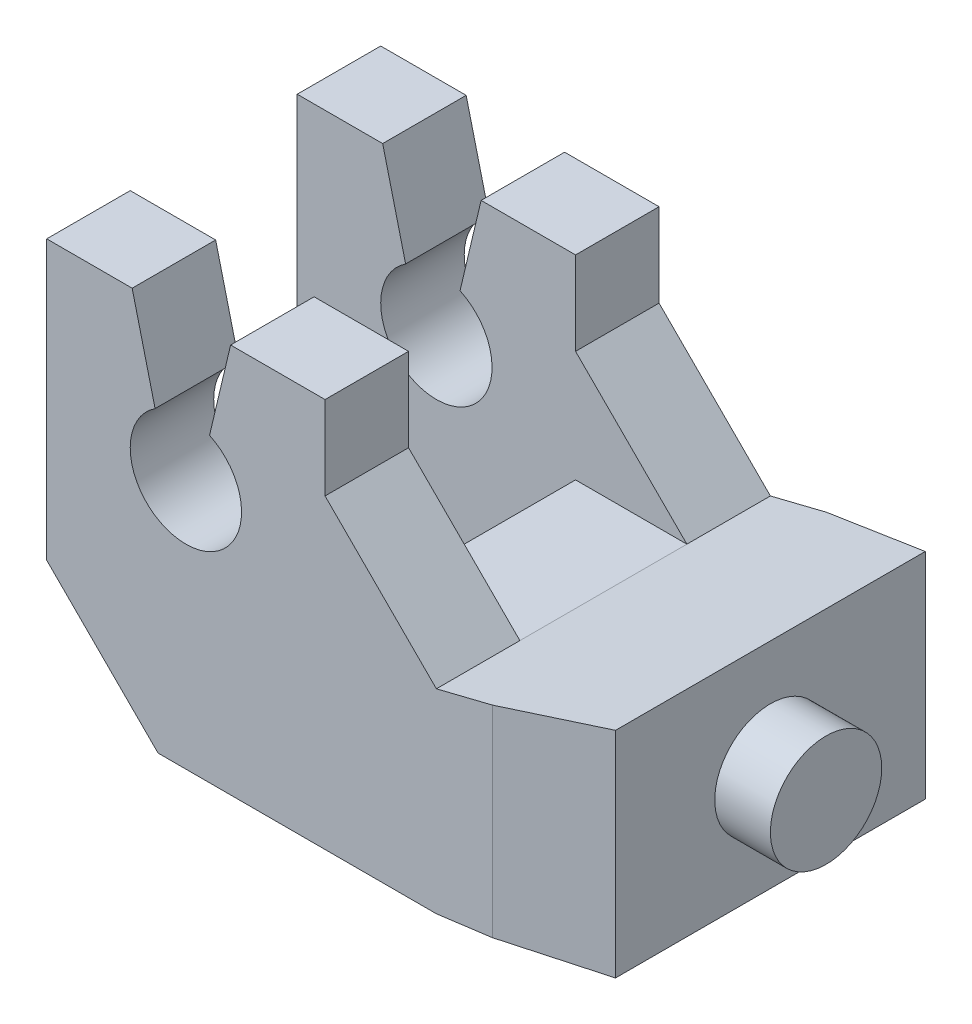
ISO-10303-21;
HEADER;
FILE_DESCRIPTION(('STEP AP214'),'2;1');
FILE_NAME('part.step','',(''),(''),'','','');
FILE_SCHEMA(('AUTOMOTIVE_DESIGN { 1 0 10303 214 1 1 1 1 }'));
ENDSEC;
DATA;
#1=APPLICATION_CONTEXT('core data for automotive mechanical design processes');
#2=APPLICATION_PROTOCOL_DEFINITION('international standard','automotive_design',2000,#1);
#3=PRODUCT_CONTEXT('',#1,'mechanical');
#4=PRODUCT('Part','Part','',(#3));
#5=PRODUCT_RELATED_PRODUCT_CATEGORY('part','',(#4));
#6=PRODUCT_DEFINITION_FORMATION('','',#4);
#7=PRODUCT_DEFINITION_CONTEXT('part definition',#1,'design');
#8=PRODUCT_DEFINITION('design','',#6,#7);
#9=PRODUCT_DEFINITION_SHAPE('','',#8);
#10=(LENGTH_UNIT() NAMED_UNIT(*) SI_UNIT(.MILLI.,.METRE.));
#11=(NAMED_UNIT(*) PLANE_ANGLE_UNIT() SI_UNIT($,.RADIAN.));
#12=(NAMED_UNIT(*) SI_UNIT($,.STERADIAN.) SOLID_ANGLE_UNIT());
#13=UNCERTAINTY_MEASURE_WITH_UNIT(LENGTH_MEASURE(1.E-05),#10,'distance_accuracy_value','');
#14=(GEOMETRIC_REPRESENTATION_CONTEXT(3) GLOBAL_UNCERTAINTY_ASSIGNED_CONTEXT((#13)) GLOBAL_UNIT_ASSIGNED_CONTEXT((#10,
#11,#12)) REPRESENTATION_CONTEXT('',''));
#15=CARTESIAN_POINT('',(0.,0.,0.));
#16=DIRECTION('',(0.,0.,1.));
#17=DIRECTION('',(1.,0.,0.));
#18=AXIS2_PLACEMENT_3D('',#15,#16,#17);
#19=CARTESIAN_POINT('',(0.,25.,30.));
#20=DIRECTION('',(0.,1.,0.));
#21=DIRECTION('',(0.,0.,1.));
#22=AXIS2_PLACEMENT_3D('',#19,#20,#21);
#23=PLANE('',#22);
#24=DIRECTION('',(0.,0.,-1.));
#25=VECTOR('',#24,1.);
#26=CARTESIAN_POINT('',(8.03300032595189,25.,54.3015491743099));
#27=LINE('',#26,#25);
#28=CARTESIAN_POINT('',(8.03300032595189,25.,-15.));
#29=VERTEX_POINT('',#28);
#30=CARTESIAN_POINT('',(8.03300032595189,25.,-30.));
#31=VERTEX_POINT('',#30);
#32=EDGE_CURVE('E505',#29,#31,#27,.T.);
#33=ORIENTED_EDGE('',*,*,#32,.F.);
#34=DIRECTION('',(1.,0.,0.));
#35=VECTOR('',#34,1.);
#36=CARTESIAN_POINT('',(0.,25.,-15.));
#37=LINE('',#36,#35);
#38=CARTESIAN_POINT('',(25.,25.,-15.));
#39=VERTEX_POINT('',#38);
#40=EDGE_CURVE('E439',#29,#39,#37,.T.);
#41=ORIENTED_EDGE('',*,*,#40,.T.);
#42=DIRECTION('',(0.,0.,-1.));
#43=VECTOR('',#42,1.);
#44=CARTESIAN_POINT('',(25.,25.,30.));
#45=LINE('',#44,#43);
#46=CARTESIAN_POINT('',(25.,25.,-30.));
#47=VERTEX_POINT('',#46);
#48=EDGE_CURVE('E328',#39,#47,#45,.T.);
#49=ORIENTED_EDGE('',*,*,#48,.T.);
#50=DIRECTION('',(1.,0.,0.));
#51=VECTOR('',#50,1.);
#52=CARTESIAN_POINT('',(0.,25.,-30.));
#53=LINE('',#52,#51);
#54=EDGE_CURVE('E315',#31,#47,#53,.T.);
#55=ORIENTED_EDGE('',*,*,#54,.F.);
#56=EDGE_LOOP('',(#33,#41,#49,#55));
#57=FACE_BOUND('',#56,.T.);
#58=ADVANCED_FACE('F53',(#57),#23,.T.);
#59=CARTESIAN_POINT('',(8.03300032595189,25.,30.));
#60=VERTEX_POINT('',#59);
#61=CARTESIAN_POINT('',(8.03300032595189,25.,15.));
#62=VERTEX_POINT('',#61);
#63=EDGE_CURVE('E507',#60,#62,#27,.T.);
#64=ORIENTED_EDGE('',*,*,#63,.F.);
#65=DIRECTION('',(1.,0.,0.));
#66=VECTOR('',#65,1.);
#67=CARTESIAN_POINT('',(0.,25.,30.));
#68=LINE('',#67,#66);
#69=CARTESIAN_POINT('',(25.,25.,30.));
#70=VERTEX_POINT('',#69);
#71=EDGE_CURVE('E244',#60,#70,#68,.T.);
#72=ORIENTED_EDGE('',*,*,#71,.T.);
#73=CARTESIAN_POINT('',(25.,25.,15.));
#74=VERTEX_POINT('',#73);
#75=EDGE_CURVE('E329',#70,#74,#45,.T.);
#76=ORIENTED_EDGE('',*,*,#75,.T.);
#77=DIRECTION('',(1.,0.,0.));
#78=VECTOR('',#77,1.);
#79=CARTESIAN_POINT('',(0.,25.,15.));
#80=LINE('',#79,#78);
#81=EDGE_CURVE('E462',#62,#74,#80,.T.);
#82=ORIENTED_EDGE('',*,*,#81,.F.);
#83=EDGE_LOOP('',(#64,#72,#76,#82));
#84=FACE_BOUND('',#83,.T.);
#85=ADVANCED_FACE('F535',(#84),#23,.T.);
#86=CARTESIAN_POINT('',(6.5430535547537,-50.0318697234433,30.));
#87=DIRECTION('',(0.129673524416725,-0.991556744248833,0.));
#88=DIRECTION('',(0.991556744248833,0.129673524416725,0.));
#89=AXIS2_PLACEMENT_3D('',#86,#87,#88);
#90=PLANE('',#89);
#91=DIRECTION('',(-0.985798498601788,-0.128920474213758,-0.107614271743853));
#92=VECTOR('',#91,1.);
#93=CARTESIAN_POINT('',(13.4702441494748,-49.1259475723067,-34.5416810296495));
#94=LINE('',#93,#92);
#95=CARTESIAN_POINT('',(75.,-41.0792267528315,-27.8248115316507));
#96=VERTEX_POINT('',#95);
#97=CARTESIAN_POINT('',(55.0742272235172,-43.6850737682847,-30.));
#98=VERTEX_POINT('',#97);
#99=EDGE_CURVE('E415',#96,#98,#94,.T.);
#100=ORIENTED_EDGE('',*,*,#99,.F.);
#101=DIRECTION('',(0.,0.,1.));
#102=VECTOR('',#101,1.);
#103=CARTESIAN_POINT('',(75.,-41.0792267528315,30.));
#104=LINE('',#103,#102);
#105=CARTESIAN_POINT('',(75.,-41.0792267528315,27.8248115316507));
#106=VERTEX_POINT('',#105);
#107=EDGE_CURVE('E404',#96,#106,#104,.T.);
#108=ORIENTED_EDGE('',*,*,#107,.T.);
#109=DIRECTION('',(-0.985798498601788,-0.128920474213758,0.107614271743853));
#110=VECTOR('',#109,1.);
#111=CARTESIAN_POINT('',(7.10508489868191,-49.9583685490299,35.236530918627));
#112=LINE('',#111,#110);
#113=CARTESIAN_POINT('',(55.074227223517,-43.6850737682847,30.));
#114=VERTEX_POINT('',#113);
#115=EDGE_CURVE('E422',#106,#114,#112,.T.);
#116=ORIENTED_EDGE('',*,*,#115,.T.);
#117=DIRECTION('',(-0.991556744248833,-0.129673524416725,0.));
#118=VECTOR('',#117,1.);
#119=CARTESIAN_POINT('',(6.5430535547537,-50.0318697234433,30.));
#120=LINE('',#119,#118);
#121=CARTESIAN_POINT('',(45.0022623154872,-45.0022623154871,30.));
#122=VERTEX_POINT('',#121);
#123=EDGE_CURVE('E271',#114,#122,#120,.T.);
#124=ORIENTED_EDGE('',*,*,#123,.T.);
#125=DIRECTION('',(0.,0.,-1.));
#126=VECTOR('',#125,1.);
#127=CARTESIAN_POINT('',(45.0022623154872,-45.0022623154871,30.));
#128=LINE('',#127,#126);
#129=CARTESIAN_POINT('',(45.0022623154872,-45.0022623154871,-30.));
#130=VERTEX_POINT('',#129);
#131=EDGE_CURVE('E338',#122,#130,#128,.T.);
#132=ORIENTED_EDGE('',*,*,#131,.T.);
#133=DIRECTION('',(-0.991556744248833,-0.129673524416725,0.));
#134=VECTOR('',#133,1.);
#135=CARTESIAN_POINT('',(6.5430535547537,-50.0318697234433,-30.));
#136=LINE('',#135,#134);
#137=EDGE_CURVE('E304',#98,#130,#136,.T.);
#138=ORIENTED_EDGE('',*,*,#137,.F.);
#139=EDGE_LOOP('',(#100,#108,#116,#124,#132,#138));
#140=FACE_BOUND('',#139,.T.);
#141=ADVANCED_FACE('F542',(#140),#90,.T.);
#142=CARTESIAN_POINT('',(4.9547361598082,-19.9470303665329,30.));
#143=DIRECTION('',(-0.241069014795778,0.970507975292008,0.));
#144=DIRECTION('',(-0.970507975292008,-0.241069014795778,0.));
#145=AXIS2_PLACEMENT_3D('',#142,#143,#144);
#146=PLANE('',#145);
#147=DIRECTION('',(0.965106735807369,0.239727375659998,-0.1053554643026));
#148=VECTOR('',#147,1.);
#149=CARTESIAN_POINT('',(5.51105117651429,-19.8088446777929,35.4105429285758));
#150=LINE('',#149,#148);
#151=CARTESIAN_POINT('',(55.0742272235172,-7.49761558541405,30.));
#152=VERTEX_POINT('',#151);
#153=CARTESIAN_POINT('',(75.,-2.54815969781461,27.8248115316507));
#154=VERTEX_POINT('',#153);
#155=EDGE_CURVE('E418',#152,#154,#150,.T.);
#156=ORIENTED_EDGE('',*,*,#155,.T.);
#157=DIRECTION('',(0.,0.,-1.));
#158=VECTOR('',#157,1.);
#159=CARTESIAN_POINT('',(75.,-2.54815969781461,30.));
#160=LINE('',#159,#158);
#161=CARTESIAN_POINT('',(75.,-2.54815969781461,-27.8248115316507));
#162=VERTEX_POINT('',#161);
#163=EDGE_CURVE('E400',#154,#162,#160,.T.);
#164=ORIENTED_EDGE('',*,*,#163,.T.);
#165=DIRECTION('',(0.965106735807369,0.239727375659998,0.1053554643026));
#166=VECTOR('',#165,1.);
#167=CARTESIAN_POINT('',(11.6118072716674,-18.2934493396707,-34.7445564970709));
#168=LINE('',#167,#166);
#169=CARTESIAN_POINT('',(55.074227223517,-7.49761558541404,-30.));
#170=VERTEX_POINT('',#169);
#171=EDGE_CURVE('E411',#170,#162,#168,.T.);
#172=ORIENTED_EDGE('',*,*,#171,.F.);
#173=DIRECTION('',(0.970507975292008,0.241069014795778,0.));
#174=VECTOR('',#173,1.);
#175=CARTESIAN_POINT('',(4.9547361598082,-19.9470303665329,-30.));
#176=LINE('',#175,#174);
#177=CARTESIAN_POINT('',(45.,-10.,-30.));
#178=VERTEX_POINT('',#177);
#179=EDGE_CURVE('E307',#178,#170,#176,.T.);
#180=ORIENTED_EDGE('',*,*,#179,.F.);
#181=DIRECTION('',(0.,0.,-1.));
#182=VECTOR('',#181,1.);
#183=CARTESIAN_POINT('',(45.,-10.,30.));
#184=LINE('',#183,#182);
#185=CARTESIAN_POINT('',(45.,-10.,-15.));
#186=VERTEX_POINT('',#185);
#187=EDGE_CURVE('E333',#186,#178,#184,.T.);
#188=ORIENTED_EDGE('',*,*,#187,.F.);
#189=CARTESIAN_POINT('',(45.,-10.,15.));
#190=VERTEX_POINT('',#189);
#191=EDGE_CURVE('E339',#190,#186,#184,.T.);
#192=ORIENTED_EDGE('',*,*,#191,.F.);
#193=CARTESIAN_POINT('',(45.,-10.,30.));
#194=VERTEX_POINT('',#193);
#195=EDGE_CURVE('E334',#194,#190,#184,.T.);
#196=ORIENTED_EDGE('',*,*,#195,.F.);
#197=DIRECTION('',(0.970507975292008,0.241069014795778,0.));
#198=VECTOR('',#197,1.);
#199=CARTESIAN_POINT('',(4.9547361598082,-19.9470303665329,30.));
#200=LINE('',#199,#198);
#201=EDGE_CURVE('E274',#194,#152,#200,.T.);
#202=ORIENTED_EDGE('',*,*,#201,.T.);
#203=EDGE_LOOP('',(#156,#164,#172,#180,#188,#192,#196,#202));
#204=FACE_BOUND('',#203,.T.);
#205=ADVANCED_FACE('F616',(#204),#146,.T.);
#206=CARTESIAN_POINT('',(3.88495481745911,-45.0022623154871,-35.5880550425761));
#207=DIRECTION('',(-0.10851987710541,0.,0.994094279368424));
#208=DIRECTION('',(0.994094279368424,0.,0.10851987710541));
#209=AXIS2_PLACEMENT_3D('',#206,#207,#208);
#210=PLANE('',#209);
#211=DIRECTION('',(0.,1.,0.));
#212=VECTOR('',#211,1.);
#213=CARTESIAN_POINT('',(75.,-45.0022623154871,-27.8248115316507));
#214=LINE('',#213,#212);
#215=EDGE_CURVE('E408',#96,#162,#214,.T.);
#216=ORIENTED_EDGE('',*,*,#215,.F.);
#217=ORIENTED_EDGE('',*,*,#99,.T.);
#218=DIRECTION('',(0.,-1.,0.));
#219=VECTOR('',#218,1.);
#220=CARTESIAN_POINT('',(55.0742272235172,0.,-30.));
#221=LINE('',#220,#219);
#222=EDGE_CURVE('E375',#170,#98,#221,.T.);
#223=ORIENTED_EDGE('',*,*,#222,.F.);
#224=ORIENTED_EDGE('',*,*,#171,.T.);
#225=EDGE_LOOP('',(#216,#217,#223,#224));
#226=FACE_BOUND('',#225,.T.);
#227=ADVANCED_FACE('F626',(#226),#210,.F.);
#228=CARTESIAN_POINT('',(3.88495481745911,-45.0022623154871,35.5880550425761));
#229=DIRECTION('',(0.10851987710541,0.,0.994094279368424));
#230=DIRECTION('',(0.994094279368424,0.,-0.10851987710541));
#231=AXIS2_PLACEMENT_3D('',#228,#229,#230);
#232=PLANE('',#231);
#233=ORIENTED_EDGE('',*,*,#115,.F.);
#234=DIRECTION('',(0.,1.,0.));
#235=VECTOR('',#234,1.);
#236=CARTESIAN_POINT('',(75.,-45.0022623154871,27.8248115316507));
#237=LINE('',#236,#235);
#238=EDGE_CURVE('E383',#106,#154,#237,.T.);
#239=ORIENTED_EDGE('',*,*,#238,.T.);
#240=ORIENTED_EDGE('',*,*,#155,.F.);
#241=DIRECTION('',(0.,1.,0.));
#242=VECTOR('',#241,1.);
#243=CARTESIAN_POINT('',(55.0742272235172,0.,30.));
#244=LINE('',#243,#242);
#245=EDGE_CURVE('E379',#114,#152,#244,.T.);
#246=ORIENTED_EDGE('',*,*,#245,.F.);
#247=EDGE_LOOP('',(#233,#239,#240,#246));
#248=FACE_BOUND('',#247,.T.);
#249=ADVANCED_FACE('F620',(#248),#232,.T.);
#250=CARTESIAN_POINT('',(0.,0.,30.));
#251=DIRECTION('',(0.,0.,1.));
#252=DIRECTION('',(1.,0.,0.));
#253=AXIS2_PLACEMENT_3D('',#250,#251,#252);
#254=PLANE('',#253);
#255=DIRECTION('',(-0.230772276710055,-0.973007788407707,0.));
#256=VECTOR('',#255,1.);
#257=CARTESIAN_POINT('',(8.03300032595189,25.,30.));
#258=LINE('',#257,#256);
#259=CARTESIAN_POINT('',(4.25047825097112,9.05170893467203,30.));
#260=VERTEX_POINT('',#259);
#261=EDGE_CURVE('E229',#60,#260,#258,.T.);
#262=ORIENTED_EDGE('',*,*,#261,.T.);
#263=CARTESIAN_POINT('',(0.,0.,30.));
#264=DIRECTION('',(0.,0.,1.));
#265=DIRECTION('',(1.,0.,0.));
#266=AXIS2_PLACEMENT_3D('',#263,#264,#265);
#267=CIRCLE('',#266,10.);
#268=CARTESIAN_POINT('',(-5.53088138921775,8.33122746408983,30.));
#269=VERTEX_POINT('',#268);
#270=EDGE_CURVE('E242',#269,#260,#267,.T.);
#271=ORIENTED_EDGE('',*,*,#270,.F.);
#272=DIRECTION('',(-0.23994426278264,0.970786665935259,0.));
#273=VECTOR('',#272,1.);
#274=CARTESIAN_POINT('',(-9.65081471542106,25.,30.));
#275=LINE('',#274,#273);
#276=CARTESIAN_POINT('',(-9.65081471542106,25.,30.));
#277=VERTEX_POINT('',#276);
#278=EDGE_CURVE('E509',#269,#277,#275,.T.);
#279=ORIENTED_EDGE('',*,*,#278,.T.);
#280=CARTESIAN_POINT('',(-25.,25.,30.));
#281=VERTEX_POINT('',#280);
#282=EDGE_CURVE('E282',#281,#277,#68,.T.);
#283=ORIENTED_EDGE('',*,*,#282,.F.);
#284=DIRECTION('',(0.,1.,0.));
#285=VECTOR('',#284,1.);
#286=CARTESIAN_POINT('',(-25.,0.,30.));
#287=LINE('',#286,#285);
#288=CARTESIAN_POINT('',(-25.,-25.,30.));
#289=VERTEX_POINT('',#288);
#290=EDGE_CURVE('E286',#289,#281,#287,.T.);
#291=ORIENTED_EDGE('',*,*,#290,.F.);
#292=DIRECTION('',(-0.707106781186549,0.707106781186546,0.));
#293=VECTOR('',#292,1.);
#294=CARTESIAN_POINT('',(-24.9999999999999,-25.0000000000001,30.));
#295=LINE('',#294,#293);
#296=CARTESIAN_POINT('',(-4.99773768451284,-45.0022623154871,30.));
#297=VERTEX_POINT('',#296);
#298=EDGE_CURVE('E251',#297,#289,#295,.T.);
#299=ORIENTED_EDGE('',*,*,#298,.F.);
#300=DIRECTION('',(-1.,0.,0.));
#301=VECTOR('',#300,1.);
#302=CARTESIAN_POINT('',(0.,-45.0022623154871,30.));
#303=LINE('',#302,#301);
#304=EDGE_CURVE('E258',#122,#297,#303,.T.);
#305=ORIENTED_EDGE('',*,*,#304,.F.);
#306=ORIENTED_EDGE('',*,*,#123,.F.);
#307=ORIENTED_EDGE('',*,*,#245,.T.);
#308=ORIENTED_EDGE('',*,*,#201,.F.);
#309=DIRECTION('',(0.707106781186544,-0.707106781186551,0.));
#310=VECTOR('',#309,1.);
#311=CARTESIAN_POINT('',(25.,10.0000000000002,30.));
#312=LINE('',#311,#310);
#313=CARTESIAN_POINT('',(25.,10.0000000000002,30.));
#314=VERTEX_POINT('',#313);
#315=EDGE_CURVE('E372',#194,#314,#312,.F.);
#316=ORIENTED_EDGE('',*,*,#315,.T.);
#317=DIRECTION('',(0.,-1.,0.));
#318=VECTOR('',#317,1.);
#319=CARTESIAN_POINT('',(25.,0.,30.));
#320=LINE('',#319,#318);
#321=EDGE_CURVE('E278',#70,#314,#320,.T.);
#322=ORIENTED_EDGE('',*,*,#321,.F.);
#323=ORIENTED_EDGE('',*,*,#71,.F.);
#324=EDGE_LOOP('',(#262,#271,#279,#283,#291,#299,#305,#306,#307,#308,#316,#322,#323));
#325=FACE_BOUND('',#324,.T.);
#326=ADVANCED_FACE('F240',(#325),#254,.T.);
#327=CARTESIAN_POINT('',(-24.9999999999999,-25.0000000000001,30.));
#328=DIRECTION('',(-0.707106781186546,-0.707106781186549,0.));
#329=DIRECTION('',(0.707106781186549,-0.707106781186546,0.));
#330=AXIS2_PLACEMENT_3D('',#327,#328,#329);
#331=PLANE('',#330);
#332=DIRECTION('',(0.,0.,-1.));
#333=VECTOR('',#332,1.);
#334=CARTESIAN_POINT('',(-4.99773768451284,-45.0022623154871,30.));
#335=LINE('',#334,#333);
#336=CARTESIAN_POINT('',(-4.99773768451284,-45.0022623154871,-15.));
#337=VERTEX_POINT('',#336);
#338=CARTESIAN_POINT('',(-4.99773768451284,-45.0022623154871,-30.));
#339=VERTEX_POINT('',#338);
#340=EDGE_CURVE('E343',#337,#339,#335,.T.);
#341=ORIENTED_EDGE('',*,*,#340,.F.);
#342=DIRECTION('',(-0.707106781186549,0.707106781186546,0.));
#343=VECTOR('',#342,1.);
#344=CARTESIAN_POINT('',(-24.9999999999999,-25.0000000000001,-15.));
#345=LINE('',#344,#343);
#346=CARTESIAN_POINT('',(-25.,-25.,-15.));
#347=VERTEX_POINT('',#346);
#348=EDGE_CURVE('E448',#337,#347,#345,.T.);
#349=ORIENTED_EDGE('',*,*,#348,.T.);
#350=DIRECTION('',(0.,0.,-1.));
#351=VECTOR('',#350,1.);
#352=CARTESIAN_POINT('',(-25.,-25.,30.));
#353=LINE('',#352,#351);
#354=CARTESIAN_POINT('',(-25.,-25.,-30.));
#355=VERTEX_POINT('',#354);
#356=EDGE_CURVE('E290',#347,#355,#353,.T.);
#357=ORIENTED_EDGE('',*,*,#356,.T.);
#358=DIRECTION('',(-0.707106781186549,0.707106781186546,0.));
#359=VECTOR('',#358,1.);
#360=CARTESIAN_POINT('',(-24.9999999999999,-25.0000000000001,-30.));
#361=LINE('',#360,#359);
#362=EDGE_CURVE('E295',#339,#355,#361,.T.);
#363=ORIENTED_EDGE('',*,*,#362,.F.);
#364=EDGE_LOOP('',(#341,#349,#357,#363));
#365=FACE_BOUND('',#364,.T.);
#366=ADVANCED_FACE('F566',(#365),#331,.T.);
#367=CARTESIAN_POINT('',(25.,0.,30.));
#368=DIRECTION('',(1.,0.,0.));
#369=DIRECTION('',(0.,1.,0.));
#370=AXIS2_PLACEMENT_3D('',#367,#368,#369);
#371=PLANE('',#370);
#372=DIRECTION('',(0.,-1.,0.));
#373=VECTOR('',#372,1.);
#374=CARTESIAN_POINT('',(25.,0.,-15.));
#375=LINE('',#374,#373);
#376=CARTESIAN_POINT('',(25.,10.0000000000002,-15.));
#377=VERTEX_POINT('',#376);
#378=EDGE_CURVE('E435',#39,#377,#375,.T.);
#379=ORIENTED_EDGE('',*,*,#378,.T.);
#380=DIRECTION('',(0.,0.,-1.));
#381=VECTOR('',#380,1.);
#382=CARTESIAN_POINT('',(25.,10.0000000000002,-30.));
#383=LINE('',#382,#381);
#384=CARTESIAN_POINT('',(25.,10.0000000000002,-30.));
#385=VERTEX_POINT('',#384);
#386=EDGE_CURVE('E348',#377,#385,#383,.T.);
#387=ORIENTED_EDGE('',*,*,#386,.T.);
#388=DIRECTION('',(0.,-1.,0.));
#389=VECTOR('',#388,1.);
#390=CARTESIAN_POINT('',(25.,0.,-30.));
#391=LINE('',#390,#389);
#392=EDGE_CURVE('E311',#47,#385,#391,.T.);
#393=ORIENTED_EDGE('',*,*,#392,.F.);
#394=ORIENTED_EDGE('',*,*,#48,.F.);
#395=EDGE_LOOP('',(#379,#387,#393,#394));
#396=FACE_BOUND('',#395,.T.);
#397=ADVANCED_FACE('F557',(#396),#371,.T.);
#398=DIRECTION('',(0.,0.,-1.));
#399=VECTOR('',#398,1.);
#400=CARTESIAN_POINT('',(-9.65081471542106,25.,54.3015491743099));
#401=LINE('',#400,#399);
#402=CARTESIAN_POINT('',(-9.65081471542106,25.,-15.));
#403=VERTEX_POINT('',#402);
#404=CARTESIAN_POINT('',(-9.65081471542106,25.,-30.));
#405=VERTEX_POINT('',#404);
#406=EDGE_CURVE('E69',#403,#405,#401,.T.);
#407=ORIENTED_EDGE('',*,*,#406,.T.);
#408=CARTESIAN_POINT('',(-25.,25.,-30.));
#409=VERTEX_POINT('',#408);
#410=EDGE_CURVE('E262',#409,#405,#53,.T.);
#411=ORIENTED_EDGE('',*,*,#410,.F.);
#412=DIRECTION('',(0.,0.,-1.));
#413=VECTOR('',#412,1.);
#414=CARTESIAN_POINT('',(-25.,25.,30.));
#415=LINE('',#414,#413);
#416=CARTESIAN_POINT('',(-25.,25.,-15.));
#417=VERTEX_POINT('',#416);
#418=EDGE_CURVE('E323',#417,#409,#415,.T.);
#419=ORIENTED_EDGE('',*,*,#418,.F.);
#420=EDGE_CURVE('E440',#417,#403,#37,.T.);
#421=ORIENTED_EDGE('',*,*,#420,.T.);
#422=EDGE_LOOP('',(#407,#411,#419,#421));
#423=FACE_BOUND('',#422,.T.);
#424=ADVANCED_FACE('F544',(#423),#23,.T.);
#425=CARTESIAN_POINT('',(0.,0.,30.));
#426=DIRECTION('',(0.,0.,-1.));
#427=DIRECTION('',(-1.,0.,0.));
#428=AXIS2_PLACEMENT_3D('',#425,#426,#427);
#429=CYLINDRICAL_SURFACE('',#428,10.);
#430=DIRECTION('',(0.,0.,-1.));
#431=VECTOR('',#430,1.);
#432=CARTESIAN_POINT('',(4.25047825097112,9.05170893467203,54.3015491743099));
#433=LINE('',#432,#431);
#434=CARTESIAN_POINT('',(4.25047825097112,9.05170893467203,-15.));
#435=VERTEX_POINT('',#434);
#436=CARTESIAN_POINT('',(4.25047825097112,9.05170893467203,-30.));
#437=VERTEX_POINT('',#436);
#438=EDGE_CURVE('E77',#435,#437,#433,.T.);
#439=ORIENTED_EDGE('',*,*,#438,.T.);
#440=CARTESIAN_POINT('',(0.,0.,-30.));
#441=DIRECTION('',(0.,0.,1.));
#442=DIRECTION('',(1.,0.,0.));
#443=AXIS2_PLACEMENT_3D('',#440,#441,#442);
#444=CIRCLE('',#443,10.);
#445=CARTESIAN_POINT('',(-5.53088138921775,8.33122746408983,-30.));
#446=VERTEX_POINT('',#445);
#447=EDGE_CURVE('E291',#446,#437,#444,.T.);
#448=ORIENTED_EDGE('',*,*,#447,.F.);
#449=DIRECTION('',(0.,0.,-1.));
#450=VECTOR('',#449,1.);
#451=CARTESIAN_POINT('',(-5.53088138921775,8.33122746408983,54.3015491743099));
#452=LINE('',#451,#450);
#453=CARTESIAN_POINT('',(-5.53088138921775,8.33122746408983,-15.));
#454=VERTEX_POINT('',#453);
#455=EDGE_CURVE('E235',#454,#446,#452,.T.);
#456=ORIENTED_EDGE('',*,*,#455,.F.);
#457=CARTESIAN_POINT('',(0.,0.,-15.));
#458=DIRECTION('',(0.,0.,1.));
#459=DIRECTION('',(1.,0.,0.));
#460=AXIS2_PLACEMENT_3D('',#457,#458,#459);
#461=CIRCLE('',#460,10.);
#462=EDGE_CURVE('E426',#454,#435,#461,.T.);
#463=ORIENTED_EDGE('',*,*,#462,.T.);
#464=EDGE_LOOP('',(#439,#448,#456,#463));
#465=FACE_BOUND('',#464,.T.);
#466=ADVANCED_FACE('F554',(#465),#429,.F.);
#467=CARTESIAN_POINT('',(-25.,0.,30.));
#468=DIRECTION('',(-1.,0.,0.));
#469=DIRECTION('',(0.,-1.,0.));
#470=AXIS2_PLACEMENT_3D('',#467,#468,#469);
#471=PLANE('',#470);
#472=ORIENTED_EDGE('',*,*,#356,.F.);
#473=DIRECTION('',(0.,1.,0.));
#474=VECTOR('',#473,1.);
#475=CARTESIAN_POINT('',(-25.,0.,-15.));
#476=LINE('',#475,#474);
#477=EDGE_CURVE('E444',#347,#417,#476,.T.);
#478=ORIENTED_EDGE('',*,*,#477,.T.);
#479=ORIENTED_EDGE('',*,*,#418,.T.);
#480=DIRECTION('',(0.,1.,0.));
#481=VECTOR('',#480,1.);
#482=CARTESIAN_POINT('',(-25.,0.,-30.));
#483=LINE('',#482,#481);
#484=EDGE_CURVE('E252',#355,#409,#483,.T.);
#485=ORIENTED_EDGE('',*,*,#484,.F.);
#486=EDGE_LOOP('',(#472,#478,#479,#485));
#487=FACE_BOUND('',#486,.T.);
#488=ADVANCED_FACE('F563',(#487),#471,.T.);
#489=DIRECTION('',(-0.707106781186549,0.707106781186546,0.));
#490=VECTOR('',#489,1.);
#491=CARTESIAN_POINT('',(-24.9999999999999,-25.0000000000001,15.));
#492=LINE('',#491,#490);
#493=CARTESIAN_POINT('',(-4.99773768451284,-45.0022623154871,15.));
#494=VERTEX_POINT('',#493);
#495=CARTESIAN_POINT('',(-25.,-25.,15.));
#496=VERTEX_POINT('',#495);
#497=EDGE_CURVE('E431',#494,#496,#492,.T.);
#498=ORIENTED_EDGE('',*,*,#497,.F.);
#499=EDGE_CURVE('E344',#297,#494,#335,.T.);
#500=ORIENTED_EDGE('',*,*,#499,.F.);
#501=ORIENTED_EDGE('',*,*,#298,.T.);
#502=EDGE_CURVE('E319',#289,#496,#353,.T.);
#503=ORIENTED_EDGE('',*,*,#502,.T.);
#504=EDGE_LOOP('',(#498,#500,#501,#503));
#505=FACE_BOUND('',#504,.T.);
#506=ADVANCED_FACE('F487',(#505),#331,.T.);
#507=CARTESIAN_POINT('',(0.,-45.0022623154871,30.));
#508=DIRECTION('',(0.,-1.,0.));
#509=DIRECTION('',(1.,0.,0.));
#510=AXIS2_PLACEMENT_3D('',#507,#508,#509);
#511=PLANE('',#510);
#512=DIRECTION('',(-1.,0.,0.));
#513=VECTOR('',#512,1.);
#514=CARTESIAN_POINT('',(0.,-45.0022623154871,-30.));
#515=LINE('',#514,#513);
#516=EDGE_CURVE('E300',#130,#339,#515,.T.);
#517=ORIENTED_EDGE('',*,*,#516,.F.);
#518=ORIENTED_EDGE('',*,*,#131,.F.);
#519=ORIENTED_EDGE('',*,*,#304,.T.);
#520=ORIENTED_EDGE('',*,*,#499,.T.);
#521=DIRECTION('',(0.,0.,1.));
#522=VECTOR('',#521,1.);
#523=CARTESIAN_POINT('',(-4.99773768451284,-45.0022623154871,-15.));
#524=LINE('',#523,#522);
#525=EDGE_CURVE('E296',#337,#494,#524,.T.);
#526=ORIENTED_EDGE('',*,*,#525,.F.);
#527=ORIENTED_EDGE('',*,*,#340,.T.);
#528=EDGE_LOOP('',(#517,#518,#519,#520,#526,#527));
#529=FACE_BOUND('',#528,.T.);
#530=ADVANCED_FACE('F491',(#529),#511,.T.);
#531=CARTESIAN_POINT('',(0.,-10.,30.));
#532=DIRECTION('',(0.,1.,0.));
#533=DIRECTION('',(0.,0.,1.));
#534=AXIS2_PLACEMENT_3D('',#531,#532,#533);
#535=PLANE('',#534);
#536=ORIENTED_EDGE('',*,*,#191,.T.);
#537=DIRECTION('',(-1.,0.,0.));
#538=VECTOR('',#537,1.);
#539=CARTESIAN_POINT('',(0.,-10.,-15.));
#540=LINE('',#539,#538);
#541=CARTESIAN_POINT('',(25.,-10.,-15.));
#542=VERTEX_POINT('',#541);
#543=EDGE_CURVE('E356',#186,#542,#540,.T.);
#544=ORIENTED_EDGE('',*,*,#543,.T.);
#545=DIRECTION('',(0.,0.,1.));
#546=VECTOR('',#545,1.);
#547=CARTESIAN_POINT('',(25.,-10.,-15.));
#548=LINE('',#547,#546);
#549=CARTESIAN_POINT('',(25.,-10.,15.));
#550=VERTEX_POINT('',#549);
#551=EDGE_CURVE('E265',#542,#550,#548,.T.);
#552=ORIENTED_EDGE('',*,*,#551,.T.);
#553=DIRECTION('',(1.,0.,0.));
#554=VECTOR('',#553,1.);
#555=CARTESIAN_POINT('',(0.,-10.,15.));
#556=LINE('',#555,#554);
#557=EDGE_CURVE('E352',#550,#190,#556,.T.);
#558=ORIENTED_EDGE('',*,*,#557,.T.);
#559=EDGE_LOOP('',(#536,#544,#552,#558));
#560=FACE_BOUND('',#559,.T.);
#561=ADVANCED_FACE('F479',(#560),#535,.T.);
#562=ORIENTED_EDGE('',*,*,#321,.T.);
#563=DIRECTION('',(0.,0.,-1.));
#564=VECTOR('',#563,1.);
#565=CARTESIAN_POINT('',(25.,10.0000000000002,15.));
#566=LINE('',#565,#564);
#567=CARTESIAN_POINT('',(25.,10.0000000000002,15.));
#568=VERTEX_POINT('',#567);
#569=EDGE_CURVE('E359',#314,#568,#566,.T.);
#570=ORIENTED_EDGE('',*,*,#569,.T.);
#571=DIRECTION('',(0.,-1.,0.));
#572=VECTOR('',#571,1.);
#573=CARTESIAN_POINT('',(25.,0.,15.));
#574=LINE('',#573,#572);
#575=EDGE_CURVE('E458',#74,#568,#574,.T.);
#576=ORIENTED_EDGE('',*,*,#575,.F.);
#577=ORIENTED_EDGE('',*,*,#75,.F.);
#578=EDGE_LOOP('',(#562,#570,#576,#577));
#579=FACE_BOUND('',#578,.T.);
#580=ADVANCED_FACE('F548',(#579),#371,.T.);
#581=CARTESIAN_POINT('',(-9.65081471542106,25.,15.));
#582=VERTEX_POINT('',#581);
#583=EDGE_CURVE('E503',#277,#582,#401,.T.);
#584=ORIENTED_EDGE('',*,*,#583,.T.);
#585=CARTESIAN_POINT('',(-25.,25.,15.));
#586=VERTEX_POINT('',#585);
#587=EDGE_CURVE('E463',#586,#582,#80,.T.);
#588=ORIENTED_EDGE('',*,*,#587,.F.);
#589=EDGE_CURVE('E324',#281,#586,#415,.T.);
#590=ORIENTED_EDGE('',*,*,#589,.F.);
#591=ORIENTED_EDGE('',*,*,#282,.T.);
#592=EDGE_LOOP('',(#584,#588,#590,#591));
#593=FACE_BOUND('',#592,.T.);
#594=ADVANCED_FACE('F502',(#593),#23,.T.);
#595=CARTESIAN_POINT('',(4.25047825097112,9.05170893467203,15.));
#596=VERTEX_POINT('',#595);
#597=EDGE_CURVE('E226',#260,#596,#433,.T.);
#598=ORIENTED_EDGE('',*,*,#597,.T.);
#599=CARTESIAN_POINT('',(0.,0.,15.));
#600=DIRECTION('',(0.,0.,1.));
#601=DIRECTION('',(1.,0.,0.));
#602=AXIS2_PLACEMENT_3D('',#599,#600,#601);
#603=CIRCLE('',#602,10.);
#604=CARTESIAN_POINT('',(-5.53088138921775,8.33122746408983,15.));
#605=VERTEX_POINT('',#604);
#606=EDGE_CURVE('E425',#605,#596,#603,.T.);
#607=ORIENTED_EDGE('',*,*,#606,.F.);
#608=EDGE_CURVE('E249',#269,#605,#452,.T.);
#609=ORIENTED_EDGE('',*,*,#608,.F.);
#610=ORIENTED_EDGE('',*,*,#270,.T.);
#611=EDGE_LOOP('',(#598,#607,#609,#610));
#612=FACE_BOUND('',#611,.T.);
#613=ADVANCED_FACE('F248',(#612),#429,.F.);
#614=DIRECTION('',(0.,1.,0.));
#615=VECTOR('',#614,1.);
#616=CARTESIAN_POINT('',(-25.,0.,15.));
#617=LINE('',#616,#615);
#618=EDGE_CURVE('E466',#496,#586,#617,.T.);
#619=ORIENTED_EDGE('',*,*,#618,.F.);
#620=ORIENTED_EDGE('',*,*,#502,.F.);
#621=ORIENTED_EDGE('',*,*,#290,.T.);
#622=ORIENTED_EDGE('',*,*,#589,.T.);
#623=EDGE_LOOP('',(#619,#620,#621,#622));
#624=FACE_BOUND('',#623,.T.);
#625=ADVANCED_FACE('F498',(#624),#471,.T.);
#626=CARTESIAN_POINT('',(0.,0.,-30.));
#627=DIRECTION('',(0.,0.,1.));
#628=DIRECTION('',(1.,0.,0.));
#629=AXIS2_PLACEMENT_3D('',#626,#627,#628);
#630=PLANE('',#629);
#631=ORIENTED_EDGE('',*,*,#447,.T.);
#632=DIRECTION('',(-0.230772276710055,-0.973007788407707,0.));
#633=VECTOR('',#632,1.);
#634=CARTESIAN_POINT('',(8.03300032595189,25.,-30.));
#635=LINE('',#634,#633);
#636=EDGE_CURVE('E599',#31,#437,#635,.T.);
#637=ORIENTED_EDGE('',*,*,#636,.F.);
#638=ORIENTED_EDGE('',*,*,#54,.T.);
#639=ORIENTED_EDGE('',*,*,#392,.T.);
#640=DIRECTION('',(-0.707106781186544,0.707106781186551,0.));
#641=VECTOR('',#640,1.);
#642=CARTESIAN_POINT('',(17.5000000000002,17.5,-30.));
#643=LINE('',#642,#641);
#644=EDGE_CURVE('E363',#385,#178,#643,.F.);
#645=ORIENTED_EDGE('',*,*,#644,.T.);
#646=ORIENTED_EDGE('',*,*,#179,.T.);
#647=ORIENTED_EDGE('',*,*,#222,.T.);
#648=ORIENTED_EDGE('',*,*,#137,.T.);
#649=ORIENTED_EDGE('',*,*,#516,.T.);
#650=ORIENTED_EDGE('',*,*,#362,.T.);
#651=ORIENTED_EDGE('',*,*,#484,.T.);
#652=ORIENTED_EDGE('',*,*,#410,.T.);
#653=DIRECTION('',(-0.23994426278264,0.970786665935259,0.));
#654=VECTOR('',#653,1.);
#655=CARTESIAN_POINT('',(-9.65081471542106,25.,-30.));
#656=LINE('',#655,#654);
#657=EDGE_CURVE('E245',#446,#405,#656,.T.);
#658=ORIENTED_EDGE('',*,*,#657,.F.);
#659=EDGE_LOOP('',(#631,#637,#638,#639,#645,#646,#647,#648,#649,#650,#651,#652,#658));
#660=FACE_BOUND('',#659,.T.);
#661=ADVANCED_FACE('F572',(#660),#630,.F.);
#662=CARTESIAN_POINT('',(19.3545449195841,-16.5872867378608,-15.));
#663=DIRECTION('',(-0.75930163522578,0.650738831439662,0.));
#664=DIRECTION('',(-0.650738831439662,-0.75930163522578,0.));
#665=AXIS2_PLACEMENT_3D('',#662,#663,#664);
#666=PLANE('',#665);
#667=DIRECTION('',(-0.650738831439662,-0.75930163522578,0.));
#668=VECTOR('',#667,1.);
#669=CARTESIAN_POINT('',(19.3545449195841,-16.5872867378608,15.));
#670=LINE('',#669,#668);
#671=EDGE_CURVE('E454',#550,#494,#670,.T.);
#672=ORIENTED_EDGE('',*,*,#671,.F.);
#673=ORIENTED_EDGE('',*,*,#551,.F.);
#674=DIRECTION('',(-0.650738831439662,-0.75930163522578,0.));
#675=VECTOR('',#674,1.);
#676=CARTESIAN_POINT('',(19.3545449195841,-16.5872867378608,-15.));
#677=LINE('',#676,#675);
#678=EDGE_CURVE('E430',#542,#337,#677,.T.);
#679=ORIENTED_EDGE('',*,*,#678,.T.);
#680=ORIENTED_EDGE('',*,*,#525,.T.);
#681=EDGE_LOOP('',(#672,#673,#679,#680));
#682=FACE_BOUND('',#681,.T.);
#683=ADVANCED_FACE('F482',(#682),#666,.T.);
#684=CARTESIAN_POINT('',(0.,0.,-15.));
#685=DIRECTION('',(0.,0.,1.));
#686=DIRECTION('',(1.,0.,0.));
#687=AXIS2_PLACEMENT_3D('',#684,#685,#686);
#688=PLANE('',#687);
#689=DIRECTION('',(0.230772276710055,0.973007788407707,0.));
#690=VECTOR('',#689,1.);
#691=CARTESIAN_POINT('',(1.99161555148092,-0.472359687786814,-15.));
#692=LINE('',#691,#690);
#693=EDGE_CURVE('E514',#435,#29,#692,.T.);
#694=ORIENTED_EDGE('',*,*,#693,.F.);
#695=ORIENTED_EDGE('',*,*,#462,.F.);
#696=DIRECTION('',(0.23994426278264,-0.970786665935259,0.));
#697=VECTOR('',#696,1.);
#698=CARTESIAN_POINT('',(-3.27181868249252,-0.808678311390703,-15.));
#699=LINE('',#698,#697);
#700=EDGE_CURVE('E513',#403,#454,#699,.T.);
#701=ORIENTED_EDGE('',*,*,#700,.F.);
#702=ORIENTED_EDGE('',*,*,#420,.F.);
#703=ORIENTED_EDGE('',*,*,#477,.F.);
#704=ORIENTED_EDGE('',*,*,#348,.F.);
#705=ORIENTED_EDGE('',*,*,#678,.F.);
#706=ORIENTED_EDGE('',*,*,#543,.F.);
#707=DIRECTION('',(0.707106781186544,-0.707106781186551,0.));
#708=VECTOR('',#707,1.);
#709=CARTESIAN_POINT('',(25.,10.0000000000002,-15.));
#710=LINE('',#709,#708);
#711=EDGE_CURVE('E366',#186,#377,#710,.F.);
#712=ORIENTED_EDGE('',*,*,#711,.T.);
#713=ORIENTED_EDGE('',*,*,#378,.F.);
#714=ORIENTED_EDGE('',*,*,#40,.F.);
#715=EDGE_LOOP('',(#694,#695,#701,#702,#703,#704,#705,#706,#712,#713,#714));
#716=FACE_BOUND('',#715,.T.);
#717=ADVANCED_FACE('F589',(#716),#688,.T.);
#718=CARTESIAN_POINT('',(0.,0.,15.));
#719=DIRECTION('',(0.,0.,1.));
#720=DIRECTION('',(1.,0.,0.));
#721=AXIS2_PLACEMENT_3D('',#718,#719,#720);
#722=PLANE('',#721);
#723=ORIENTED_EDGE('',*,*,#606,.T.);
#724=DIRECTION('',(0.230772276710055,0.973007788407707,0.));
#725=VECTOR('',#724,1.);
#726=CARTESIAN_POINT('',(1.99161555148092,-0.472359687786814,15.));
#727=LINE('',#726,#725);
#728=EDGE_CURVE('E13',#596,#62,#727,.T.);
#729=ORIENTED_EDGE('',*,*,#728,.T.);
#730=ORIENTED_EDGE('',*,*,#81,.T.);
#731=ORIENTED_EDGE('',*,*,#575,.T.);
#732=DIRECTION('',(-0.707106781186544,0.707106781186551,0.));
#733=VECTOR('',#732,1.);
#734=CARTESIAN_POINT('',(17.5000000000002,17.5,15.));
#735=LINE('',#734,#733);
#736=EDGE_CURVE('E369',#568,#190,#735,.F.);
#737=ORIENTED_EDGE('',*,*,#736,.T.);
#738=ORIENTED_EDGE('',*,*,#557,.F.);
#739=ORIENTED_EDGE('',*,*,#671,.T.);
#740=ORIENTED_EDGE('',*,*,#497,.T.);
#741=ORIENTED_EDGE('',*,*,#618,.T.);
#742=ORIENTED_EDGE('',*,*,#587,.T.);
#743=DIRECTION('',(0.23994426278264,-0.970786665935259,0.));
#744=VECTOR('',#743,1.);
#745=CARTESIAN_POINT('',(-3.27181868249252,-0.808678311390703,15.));
#746=LINE('',#745,#744);
#747=EDGE_CURVE('E62',#582,#605,#746,.T.);
#748=ORIENTED_EDGE('',*,*,#747,.T.);
#749=EDGE_LOOP('',(#723,#729,#730,#731,#737,#738,#739,#740,#741,#742,#748));
#750=FACE_BOUND('',#749,.T.);
#751=ADVANCED_FACE('F484',(#750),#722,.F.);
#752=CARTESIAN_POINT('',(25.,10.0000000000002,30.));
#753=DIRECTION('',(0.707106781186551,0.707106781186544,0.));
#754=DIRECTION('',(0.,0.,1.));
#755=AXIS2_PLACEMENT_3D('',#752,#753,#754);
#756=PLANE('',#755);
#757=ORIENTED_EDGE('',*,*,#711,.F.);
#758=ORIENTED_EDGE('',*,*,#187,.T.);
#759=ORIENTED_EDGE('',*,*,#644,.F.);
#760=ORIENTED_EDGE('',*,*,#386,.F.);
#761=EDGE_LOOP('',(#757,#758,#759,#760));
#762=FACE_BOUND('',#761,.T.);
#763=ADVANCED_FACE('F586',(#762),#756,.T.);
#764=CARTESIAN_POINT('',(25.,10.0000000000002,30.));
#765=DIRECTION('',(0.707106781186551,0.707106781186544,0.));
#766=DIRECTION('',(0.,0.,1.));
#767=AXIS2_PLACEMENT_3D('',#764,#765,#766);
#768=PLANE('',#767);
#769=ORIENTED_EDGE('',*,*,#315,.F.);
#770=ORIENTED_EDGE('',*,*,#195,.T.);
#771=ORIENTED_EDGE('',*,*,#736,.F.);
#772=ORIENTED_EDGE('',*,*,#569,.F.);
#773=EDGE_LOOP('',(#769,#770,#771,#772));
#774=FACE_BOUND('',#773,.T.);
#775=ADVANCED_FACE('F56',(#774),#768,.T.);
#776=CARTESIAN_POINT('',(75.,-45.0022623154871,30.));
#777=DIRECTION('',(1.,0.,0.));
#778=DIRECTION('',(0.,0.,-1.));
#779=AXIS2_PLACEMENT_3D('',#776,#777,#778);
#780=PLANE('',#779);
#781=CARTESIAN_POINT('',(75.,-22.3255367000367,0.));
#782=DIRECTION('',(1.,0.,0.));
#783=DIRECTION('',(0.,0.,-1.));
#784=AXIS2_PLACEMENT_3D('',#781,#782,#783);
#785=CIRCLE('',#784,10.);
#786=CARTESIAN_POINT('',(75.,-22.3255367000367,-10.));
#787=VERTEX_POINT('',#786);
#788=EDGE_CURVE('E386',#787,#787,#785,.T.);
#789=ORIENTED_EDGE('',*,*,#788,.F.);
#790=EDGE_LOOP('',(#789));
#791=FACE_BOUND('',#790,.T.);
#792=ORIENTED_EDGE('',*,*,#215,.T.);
#793=ORIENTED_EDGE('',*,*,#163,.F.);
#794=ORIENTED_EDGE('',*,*,#238,.F.);
#795=ORIENTED_EDGE('',*,*,#107,.F.);
#796=EDGE_LOOP('',(#792,#793,#794,#795));
#797=FACE_BOUND('',#796,.T.);
#798=ADVANCED_FACE('F524',(#791,#797),#780,.T.);
#799=CARTESIAN_POINT('',(85.,-22.3255367000367,0.));
#800=DIRECTION('',(-1.,0.,0.));
#801=DIRECTION('',(0.,0.,1.));
#802=AXIS2_PLACEMENT_3D('',#799,#800,#801);
#803=CYLINDRICAL_SURFACE('',#802,10.);
#804=CARTESIAN_POINT('',(85.,-22.3255367000367,0.));
#805=DIRECTION('',(1.,0.,0.));
#806=DIRECTION('',(0.,0.,-1.));
#807=AXIS2_PLACEMENT_3D('',#804,#805,#806);
#808=CIRCLE('',#807,10.);
#809=CARTESIAN_POINT('',(85.,-22.3255367000367,-10.));
#810=VERTEX_POINT('',#809);
#811=EDGE_CURVE('E398',#810,#810,#808,.T.);
#812=ORIENTED_EDGE('',*,*,#811,.F.);
#813=EDGE_LOOP('',(#812));
#814=FACE_BOUND('',#813,.T.);
#815=ORIENTED_EDGE('',*,*,#788,.T.);
#816=EDGE_LOOP('',(#815));
#817=FACE_BOUND('',#816,.T.);
#818=ADVANCED_FACE('F522',(#814,#817),#803,.T.);
#819=CARTESIAN_POINT('',(85.,-22.3255367000367,0.));
#820=DIRECTION('',(1.,0.,0.));
#821=DIRECTION('',(0.,0.,-1.));
#822=AXIS2_PLACEMENT_3D('',#819,#820,#821);
#823=PLANE('',#822);
#824=ORIENTED_EDGE('',*,*,#811,.T.);
#825=EDGE_LOOP('',(#824));
#826=FACE_BOUND('',#825,.T.);
#827=ADVANCED_FACE('F520',(#826),#823,.T.);
#828=CARTESIAN_POINT('',(-9.65081471542106,25.,54.3015491743099));
#829=DIRECTION('',(-0.970786665935259,-0.23994426278264,0.));
#830=DIRECTION('',(0.23994426278264,-0.970786665935259,0.));
#831=AXIS2_PLACEMENT_3D('',#828,#829,#830);
#832=PLANE('',#831);
#833=ORIENTED_EDGE('',*,*,#583,.F.);
#834=ORIENTED_EDGE('',*,*,#278,.F.);
#835=ORIENTED_EDGE('',*,*,#608,.T.);
#836=ORIENTED_EDGE('',*,*,#747,.F.);
#837=EDGE_LOOP('',(#833,#834,#835,#836));
#838=FACE_BOUND('',#837,.T.);
#839=ADVANCED_FACE('F530',(#838),#832,.F.);
#840=CARTESIAN_POINT('',(8.03300032595189,25.,54.3015491743099));
#841=DIRECTION('',(0.973007788407707,-0.230772276710055,0.));
#842=DIRECTION('',(0.230772276710055,0.973007788407707,0.));
#843=AXIS2_PLACEMENT_3D('',#840,#841,#842);
#844=PLANE('',#843);
#845=ORIENTED_EDGE('',*,*,#597,.F.);
#846=ORIENTED_EDGE('',*,*,#261,.F.);
#847=ORIENTED_EDGE('',*,*,#63,.T.);
#848=ORIENTED_EDGE('',*,*,#728,.F.);
#849=EDGE_LOOP('',(#845,#846,#847,#848));
#850=FACE_BOUND('',#849,.T.);
#851=ADVANCED_FACE('F228',(#850),#844,.F.);
#852=ORIENTED_EDGE('',*,*,#700,.T.);
#853=ORIENTED_EDGE('',*,*,#455,.T.);
#854=ORIENTED_EDGE('',*,*,#657,.T.);
#855=ORIENTED_EDGE('',*,*,#406,.F.);
#856=EDGE_LOOP('',(#852,#853,#854,#855));
#857=FACE_BOUND('',#856,.T.);
#858=ADVANCED_FACE('F602',(#857),#832,.F.);
#859=ORIENTED_EDGE('',*,*,#693,.T.);
#860=ORIENTED_EDGE('',*,*,#32,.T.);
#861=ORIENTED_EDGE('',*,*,#636,.T.);
#862=ORIENTED_EDGE('',*,*,#438,.F.);
#863=EDGE_LOOP('',(#859,#860,#861,#862));
#864=FACE_BOUND('',#863,.T.);
#865=ADVANCED_FACE('F759',(#864),#844,.F.);
#866=CLOSED_SHELL('',(#58,#85,#141,#205,#227,#249,#326,#366,#397,#424,#466,#488,#506,#530,#561,
#580,#594,#613,#625,#661,#683,#717,#751,#763,#775,#798,#818,#827,#839,#851,#858,#865));
#867=MANIFOLD_SOLID_BREP('B2',#866);
#868=ADVANCED_BREP_SHAPE_REPRESENTATION('',(#18,#867),#14);
#869=SHAPE_DEFINITION_REPRESENTATION(#9,#868);
ENDSEC;
END-ISO-10303-21;
